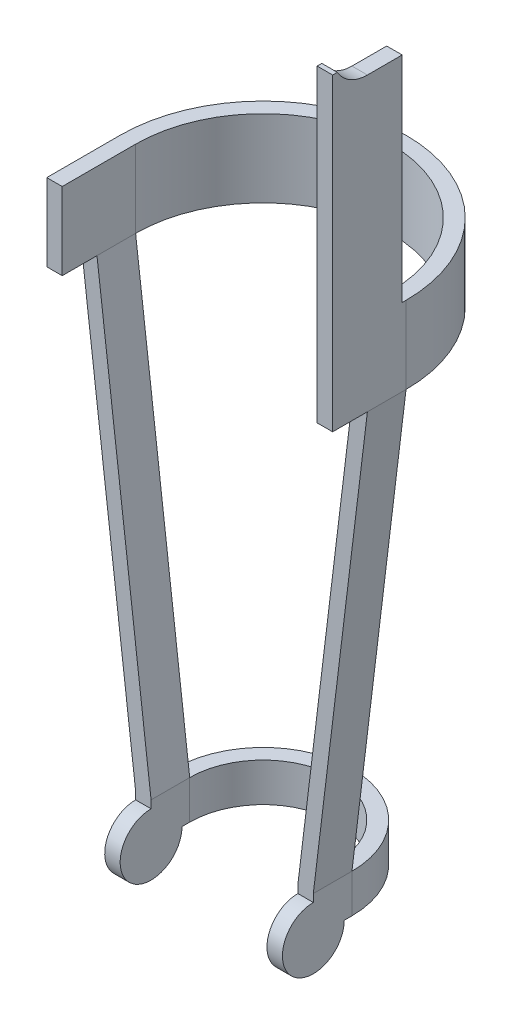
ISO-10303-21;
HEADER;
FILE_DESCRIPTION(('STEP AP214'),'2;1');
FILE_NAME('part.step','',(''),(''),'','','');
FILE_SCHEMA(('AUTOMOTIVE_DESIGN { 1 0 10303 214 1 1 1 1 }'));
ENDSEC;
DATA;
#1=APPLICATION_CONTEXT('core data for automotive mechanical design processes');
#2=APPLICATION_PROTOCOL_DEFINITION('international standard','automotive_design',2000,#1);
#3=PRODUCT_CONTEXT('',#1,'mechanical');
#4=PRODUCT('Part','Part','',(#3));
#5=PRODUCT_RELATED_PRODUCT_CATEGORY('part','',(#4));
#6=PRODUCT_DEFINITION_FORMATION('','',#4);
#7=PRODUCT_DEFINITION_CONTEXT('part definition',#1,'design');
#8=PRODUCT_DEFINITION('design','',#6,#7);
#9=PRODUCT_DEFINITION_SHAPE('','',#8);
#10=(LENGTH_UNIT() NAMED_UNIT(*) SI_UNIT(.MILLI.,.METRE.));
#11=(NAMED_UNIT(*) PLANE_ANGLE_UNIT() SI_UNIT($,.RADIAN.));
#12=(NAMED_UNIT(*) SI_UNIT($,.STERADIAN.) SOLID_ANGLE_UNIT());
#13=UNCERTAINTY_MEASURE_WITH_UNIT(LENGTH_MEASURE(1.E-05),#10,'distance_accuracy_value','');
#14=(GEOMETRIC_REPRESENTATION_CONTEXT(3) GLOBAL_UNCERTAINTY_ASSIGNED_CONTEXT((#13)) GLOBAL_UNIT_ASSIGNED_CONTEXT((#10,
#11,#12)) REPRESENTATION_CONTEXT('',''));
#15=CARTESIAN_POINT('',(0.,0.,0.));
#16=DIRECTION('',(0.,0.,1.));
#17=DIRECTION('',(1.,0.,0.));
#18=AXIS2_PLACEMENT_3D('',#15,#16,#17);
#19=CARTESIAN_POINT('',(46.,20.,20.));
#20=DIRECTION('',(0.,0.,-1.));
#21=DIRECTION('',(-1.,0.,0.));
#22=AXIS2_PLACEMENT_3D('',#19,#20,#21);
#23=PLANE('',#22);
#24=DIRECTION('',(1.,0.,0.));
#25=VECTOR('',#24,1.);
#26=CARTESIAN_POINT('',(46.,250.,20.));
#27=LINE('',#26,#25);
#28=CARTESIAN_POINT('',(66.,250.,20.));
#29=VERTEX_POINT('',#28);
#30=CARTESIAN_POINT('',(74.,250.,20.));
#31=VERTEX_POINT('',#30);
#32=EDGE_CURVE('E255',#29,#31,#27,.T.);
#33=ORIENTED_EDGE('',*,*,#32,.F.);
#34=DIRECTION('',(0.120846923167835,0.992671154592933,0.));
#35=VECTOR('',#34,1.);
#36=CARTESIAN_POINT('',(38.,20.,20.));
#37=LINE('',#36,#35);
#38=CARTESIAN_POINT('',(38.,20.,20.));
#39=VERTEX_POINT('',#38);
#40=EDGE_CURVE('E412',#39,#29,#37,.T.);
#41=ORIENTED_EDGE('',*,*,#40,.F.);
#42=DIRECTION('',(0.,-1.,0.));
#43=VECTOR('',#42,1.);
#44=CARTESIAN_POINT('',(38.,20.,20.));
#45=LINE('',#44,#43);
#46=CARTESIAN_POINT('',(38.,16.,20.));
#47=VERTEX_POINT('',#46);
#48=EDGE_CURVE('E539',#39,#47,#45,.T.);
#49=ORIENTED_EDGE('',*,*,#48,.T.);
#50=DIRECTION('',(1.,0.,0.));
#51=VECTOR('',#50,1.);
#52=CARTESIAN_POINT('',(38.,16.,20.));
#53=LINE('',#52,#51);
#54=CARTESIAN_POINT('',(46.,16.,20.));
#55=VERTEX_POINT('',#54);
#56=EDGE_CURVE('E644',#47,#55,#53,.T.);
#57=ORIENTED_EDGE('',*,*,#56,.T.);
#58=DIRECTION('',(0.,-1.,0.));
#59=VECTOR('',#58,1.);
#60=CARTESIAN_POINT('',(46.,20.,20.));
#61=LINE('',#60,#59);
#62=CARTESIAN_POINT('',(46.,20.,20.));
#63=VERTEX_POINT('',#62);
#64=EDGE_CURVE('E535',#63,#55,#61,.T.);
#65=ORIENTED_EDGE('',*,*,#64,.F.);
#66=DIRECTION('',(0.120846923167835,0.992671154592933,0.));
#67=VECTOR('',#66,1.);
#68=CARTESIAN_POINT('',(46.,20.,20.));
#69=LINE('',#68,#67);
#70=EDGE_CURVE('E381',#63,#31,#69,.T.);
#71=ORIENTED_EDGE('',*,*,#70,.T.);
#72=EDGE_LOOP('',(#33,#41,#49,#57,#65,#71));
#73=FACE_BOUND('',#72,.T.);
#74=ADVANCED_FACE('F39',(#73),#23,.F.);
#75=CARTESIAN_POINT('',(-46.,20.,20.));
#76=DIRECTION('',(0.,0.,-1.));
#77=DIRECTION('',(-1.,0.,0.));
#78=AXIS2_PLACEMENT_3D('',#75,#76,#77);
#79=PLANE('',#78);
#80=DIRECTION('',(1.,0.,0.));
#81=VECTOR('',#80,1.);
#82=CARTESIAN_POINT('',(-46.,250.,20.));
#83=LINE('',#82,#81);
#84=CARTESIAN_POINT('',(-74.,250.,20.));
#85=VERTEX_POINT('',#84);
#86=CARTESIAN_POINT('',(-66.,250.,20.));
#87=VERTEX_POINT('',#86);
#88=EDGE_CURVE('E233',#85,#87,#83,.T.);
#89=ORIENTED_EDGE('',*,*,#88,.F.);
#90=DIRECTION('',(-0.120846923167835,0.992671154592933,0.));
#91=VECTOR('',#90,1.);
#92=CARTESIAN_POINT('',(-46.,20.,20.));
#93=LINE('',#92,#91);
#94=CARTESIAN_POINT('',(-46.,20.,20.));
#95=VERTEX_POINT('',#94);
#96=EDGE_CURVE('E216',#95,#85,#93,.T.);
#97=ORIENTED_EDGE('',*,*,#96,.F.);
#98=DIRECTION('',(0.,-1.,0.));
#99=VECTOR('',#98,1.);
#100=CARTESIAN_POINT('',(-46.,20.,20.));
#101=LINE('',#100,#99);
#102=CARTESIAN_POINT('',(-46.,16.,20.));
#103=VERTEX_POINT('',#102);
#104=EDGE_CURVE('E524',#95,#103,#101,.T.);
#105=ORIENTED_EDGE('',*,*,#104,.T.);
#106=DIRECTION('',(-1.,0.,0.));
#107=VECTOR('',#106,1.);
#108=CARTESIAN_POINT('',(-38.,16.,20.));
#109=LINE('',#108,#107);
#110=CARTESIAN_POINT('',(-38.,16.,20.));
#111=VERTEX_POINT('',#110);
#112=EDGE_CURVE('E504',#103,#111,#109,.F.);
#113=ORIENTED_EDGE('',*,*,#112,.T.);
#114=DIRECTION('',(0.,-1.,0.));
#115=VECTOR('',#114,1.);
#116=CARTESIAN_POINT('',(-38.,20.,20.));
#117=LINE('',#116,#115);
#118=CARTESIAN_POINT('',(-38.,20.,20.));
#119=VERTEX_POINT('',#118);
#120=EDGE_CURVE('E493',#119,#111,#117,.T.);
#121=ORIENTED_EDGE('',*,*,#120,.F.);
#122=DIRECTION('',(-0.120846923167835,0.992671154592933,0.));
#123=VECTOR('',#122,1.);
#124=CARTESIAN_POINT('',(-38.,20.,20.));
#125=LINE('',#124,#123);
#126=EDGE_CURVE('E420',#119,#87,#125,.T.);
#127=ORIENTED_EDGE('',*,*,#126,.T.);
#128=EDGE_LOOP('',(#89,#97,#105,#113,#121,#127));
#129=FACE_BOUND('',#128,.T.);
#130=ADVANCED_FACE('F647',(#129),#79,.F.);
#131=CARTESIAN_POINT('',(0.,20.,0.));
#132=DIRECTION('',(0.,-1.,0.));
#133=DIRECTION('',(0.,0.,-1.));
#134=AXIS2_PLACEMENT_3D('',#131,#132,#133);
#135=CYLINDRICAL_SURFACE('',#134,38.);
#136=CARTESIAN_POINT('',(0.,0.,0.));
#137=DIRECTION('',(0.,-1.,0.));
#138=DIRECTION('',(0.,0.,1.));
#139=AXIS2_PLACEMENT_3D('',#136,#137,#138);
#140=CIRCLE('',#139,38.);
#141=CARTESIAN_POINT('',(-38.,0.,0.));
#142=VERTEX_POINT('',#141);
#143=CARTESIAN_POINT('',(38.,0.,0.));
#144=VERTEX_POINT('',#143);
#145=EDGE_CURVE('E499',#142,#144,#140,.T.);
#146=ORIENTED_EDGE('',*,*,#145,.T.);
#147=DIRECTION('',(0.,-1.,0.));
#148=VECTOR('',#147,1.);
#149=CARTESIAN_POINT('',(38.,20.,0.));
#150=LINE('',#149,#148);
#151=CARTESIAN_POINT('',(38.,20.,0.));
#152=VERTEX_POINT('',#151);
#153=EDGE_CURVE('E543',#152,#144,#150,.T.);
#154=ORIENTED_EDGE('',*,*,#153,.F.);
#155=CARTESIAN_POINT('',(0.,20.,0.));
#156=DIRECTION('',(0.,-1.,0.));
#157=DIRECTION('',(0.,0.,1.));
#158=AXIS2_PLACEMENT_3D('',#155,#156,#157);
#159=CIRCLE('',#158,38.);
#160=CARTESIAN_POINT('',(-38.,20.,0.));
#161=VERTEX_POINT('',#160);
#162=EDGE_CURVE('E520',#161,#152,#159,.T.);
#163=ORIENTED_EDGE('',*,*,#162,.F.);
#164=DIRECTION('',(0.,-1.,0.));
#165=VECTOR('',#164,1.);
#166=CARTESIAN_POINT('',(-38.,20.,0.));
#167=LINE('',#166,#165);
#168=EDGE_CURVE('E488',#161,#142,#167,.T.);
#169=ORIENTED_EDGE('',*,*,#168,.T.);
#170=EDGE_LOOP('',(#146,#154,#163,#169));
#171=FACE_BOUND('',#170,.T.);
#172=ADVANCED_FACE('F41',(#171),#135,.F.);
#173=CARTESIAN_POINT('',(38.,20.,0.));
#174=DIRECTION('',(1.,0.,0.));
#175=DIRECTION('',(0.,0.,-1.));
#176=AXIS2_PLACEMENT_3D('',#173,#174,#175);
#177=PLANE('',#176);
#178=DIRECTION('',(0.,0.,1.));
#179=VECTOR('',#178,1.);
#180=CARTESIAN_POINT('',(38.,0.,0.));
#181=LINE('',#180,#179);
#182=CARTESIAN_POINT('',(38.,0.,4.));
#183=VERTEX_POINT('',#182);
#184=EDGE_CURVE('E503',#144,#183,#181,.T.);
#185=ORIENTED_EDGE('',*,*,#184,.T.);
#186=CARTESIAN_POINT('',(38.,0.,20.));
#187=DIRECTION('',(1.,0.,0.));
#188=DIRECTION('',(0.,0.,-1.));
#189=AXIS2_PLACEMENT_3D('',#186,#187,#188);
#190=CIRCLE('',#189,16.);
#191=EDGE_CURVE('E385',#47,#183,#190,.T.);
#192=ORIENTED_EDGE('',*,*,#191,.F.);
#193=ORIENTED_EDGE('',*,*,#48,.F.);
#194=DIRECTION('',(0.,0.,1.));
#195=VECTOR('',#194,1.);
#196=CARTESIAN_POINT('',(38.,20.,0.));
#197=LINE('',#196,#195);
#198=EDGE_CURVE('E572',#152,#39,#197,.T.);
#199=ORIENTED_EDGE('',*,*,#198,.F.);
#200=ORIENTED_EDGE('',*,*,#153,.T.);
#201=EDGE_LOOP('',(#185,#192,#193,#199,#200));
#202=FACE_BOUND('',#201,.T.);
#203=ADVANCED_FACE('F656',(#202),#177,.F.);
#204=CARTESIAN_POINT('',(46.,20.,0.));
#205=DIRECTION('',(-1.,0.,0.));
#206=DIRECTION('',(0.,0.,1.));
#207=AXIS2_PLACEMENT_3D('',#204,#205,#206);
#208=PLANE('',#207);
#209=ORIENTED_EDGE('',*,*,#64,.T.);
#210=CARTESIAN_POINT('',(46.,0.,20.));
#211=DIRECTION('',(1.,0.,0.));
#212=DIRECTION('',(0.,0.,-1.));
#213=AXIS2_PLACEMENT_3D('',#210,#211,#212);
#214=CIRCLE('',#213,16.);
#215=CARTESIAN_POINT('',(46.,0.,4.));
#216=VERTEX_POINT('',#215);
#217=EDGE_CURVE('E416',#55,#216,#214,.T.);
#218=ORIENTED_EDGE('',*,*,#217,.T.);
#219=DIRECTION('',(0.,0.,-1.));
#220=VECTOR('',#219,1.);
#221=CARTESIAN_POINT('',(46.,0.,0.));
#222=LINE('',#221,#220);
#223=CARTESIAN_POINT('',(46.,0.,0.));
#224=VERTEX_POINT('',#223);
#225=EDGE_CURVE('E508',#216,#224,#222,.T.);
#226=ORIENTED_EDGE('',*,*,#225,.T.);
#227=DIRECTION('',(0.,-1.,0.));
#228=VECTOR('',#227,1.);
#229=CARTESIAN_POINT('',(46.,20.,0.));
#230=LINE('',#229,#228);
#231=CARTESIAN_POINT('',(46.,20.,0.));
#232=VERTEX_POINT('',#231);
#233=EDGE_CURVE('E531',#232,#224,#230,.T.);
#234=ORIENTED_EDGE('',*,*,#233,.F.);
#235=DIRECTION('',(0.,0.,-1.));
#236=VECTOR('',#235,1.);
#237=CARTESIAN_POINT('',(46.,20.,0.));
#238=LINE('',#237,#236);
#239=EDGE_CURVE('E575',#63,#232,#238,.T.);
#240=ORIENTED_EDGE('',*,*,#239,.F.);
#241=EDGE_LOOP('',(#209,#218,#226,#234,#240));
#242=FACE_BOUND('',#241,.T.);
#243=ADVANCED_FACE('F635',(#242),#208,.F.);
#244=CARTESIAN_POINT('',(0.,20.,0.));
#245=DIRECTION('',(0.,-1.,0.));
#246=DIRECTION('',(0.,0.,-1.));
#247=AXIS2_PLACEMENT_3D('',#244,#245,#246);
#248=CYLINDRICAL_SURFACE('',#247,46.);
#249=CARTESIAN_POINT('',(0.,0.,0.));
#250=DIRECTION('',(0.,1.,0.));
#251=DIRECTION('',(0.,0.,1.));
#252=AXIS2_PLACEMENT_3D('',#249,#250,#251);
#253=CIRCLE('',#252,46.);
#254=CARTESIAN_POINT('',(-46.,0.,0.));
#255=VERTEX_POINT('',#254);
#256=EDGE_CURVE('E511',#224,#255,#253,.T.);
#257=ORIENTED_EDGE('',*,*,#256,.T.);
#258=DIRECTION('',(0.,-1.,0.));
#259=VECTOR('',#258,1.);
#260=CARTESIAN_POINT('',(-46.,20.,0.));
#261=LINE('',#260,#259);
#262=CARTESIAN_POINT('',(-46.,20.,0.));
#263=VERTEX_POINT('',#262);
#264=EDGE_CURVE('E527',#263,#255,#261,.T.);
#265=ORIENTED_EDGE('',*,*,#264,.F.);
#266=CARTESIAN_POINT('',(0.,20.,0.));
#267=DIRECTION('',(0.,1.,0.));
#268=DIRECTION('',(0.,0.,1.));
#269=AXIS2_PLACEMENT_3D('',#266,#267,#268);
#270=CIRCLE('',#269,46.);
#271=EDGE_CURVE('E495',#232,#263,#270,.T.);
#272=ORIENTED_EDGE('',*,*,#271,.F.);
#273=ORIENTED_EDGE('',*,*,#233,.T.);
#274=EDGE_LOOP('',(#257,#265,#272,#273));
#275=FACE_BOUND('',#274,.T.);
#276=ADVANCED_FACE('F591',(#275),#248,.T.);
#277=CARTESIAN_POINT('',(-46.,20.,0.));
#278=DIRECTION('',(1.,0.,0.));
#279=DIRECTION('',(0.,0.,-1.));
#280=AXIS2_PLACEMENT_3D('',#277,#278,#279);
#281=PLANE('',#280);
#282=DIRECTION('',(0.,0.,1.));
#283=VECTOR('',#282,1.);
#284=CARTESIAN_POINT('',(-46.,0.,0.));
#285=LINE('',#284,#283);
#286=CARTESIAN_POINT('',(-46.,0.,4.));
#287=VERTEX_POINT('',#286);
#288=EDGE_CURVE('E514',#255,#287,#285,.T.);
#289=ORIENTED_EDGE('',*,*,#288,.T.);
#290=CARTESIAN_POINT('',(-46.,0.,20.));
#291=DIRECTION('',(-1.,0.,0.));
#292=DIRECTION('',(0.,0.,1.));
#293=AXIS2_PLACEMENT_3D('',#290,#291,#292);
#294=CIRCLE('',#293,16.);
#295=EDGE_CURVE('E640',#287,#103,#294,.T.);
#296=ORIENTED_EDGE('',*,*,#295,.T.);
#297=ORIENTED_EDGE('',*,*,#104,.F.);
#298=DIRECTION('',(0.,0.,1.));
#299=VECTOR('',#298,1.);
#300=CARTESIAN_POINT('',(-46.,20.,0.));
#301=LINE('',#300,#299);
#302=EDGE_CURVE('E453',#263,#95,#301,.T.);
#303=ORIENTED_EDGE('',*,*,#302,.F.);
#304=ORIENTED_EDGE('',*,*,#264,.T.);
#305=EDGE_LOOP('',(#289,#296,#297,#303,#304));
#306=FACE_BOUND('',#305,.T.);
#307=ADVANCED_FACE('F595',(#306),#281,.F.);
#308=CARTESIAN_POINT('',(-38.,20.,0.));
#309=DIRECTION('',(-1.,0.,0.));
#310=DIRECTION('',(0.,0.,1.));
#311=AXIS2_PLACEMENT_3D('',#308,#309,#310);
#312=PLANE('',#311);
#313=ORIENTED_EDGE('',*,*,#120,.T.);
#314=CARTESIAN_POINT('',(-38.,0.,20.));
#315=DIRECTION('',(-1.,0.,0.));
#316=DIRECTION('',(0.,0.,1.));
#317=AXIS2_PLACEMENT_3D('',#314,#315,#316);
#318=CIRCLE('',#317,16.);
#319=CARTESIAN_POINT('',(-38.,0.,4.));
#320=VERTEX_POINT('',#319);
#321=EDGE_CURVE('E643',#320,#111,#318,.T.);
#322=ORIENTED_EDGE('',*,*,#321,.F.);
#323=DIRECTION('',(0.,0.,-1.));
#324=VECTOR('',#323,1.);
#325=CARTESIAN_POINT('',(-38.,0.,0.));
#326=LINE('',#325,#324);
#327=EDGE_CURVE('E518',#320,#142,#326,.T.);
#328=ORIENTED_EDGE('',*,*,#327,.T.);
#329=ORIENTED_EDGE('',*,*,#168,.F.);
#330=DIRECTION('',(0.,0.,-1.));
#331=VECTOR('',#330,1.);
#332=CARTESIAN_POINT('',(-38.,20.,0.));
#333=LINE('',#332,#331);
#334=EDGE_CURVE('E482',#119,#161,#333,.T.);
#335=ORIENTED_EDGE('',*,*,#334,.F.);
#336=EDGE_LOOP('',(#313,#322,#328,#329,#335));
#337=FACE_BOUND('',#336,.T.);
#338=ADVANCED_FACE('F650',(#337),#312,.F.);
#339=CARTESIAN_POINT('',(0.,20.,0.));
#340=DIRECTION('',(0.,1.,0.));
#341=DIRECTION('',(0.,0.,1.));
#342=AXIS2_PLACEMENT_3D('',#339,#340,#341);
#343=PLANE('',#342);
#344=DIRECTION('',(-1.,0.,0.));
#345=VECTOR('',#344,1.);
#346=CARTESIAN_POINT('',(-46.,20.,0.));
#347=LINE('',#346,#345);
#348=EDGE_CURVE('E238',#161,#263,#347,.T.);
#349=ORIENTED_EDGE('',*,*,#348,.F.);
#350=ORIENTED_EDGE('',*,*,#162,.T.);
#351=DIRECTION('',(-1.,0.,0.));
#352=VECTOR('',#351,1.);
#353=CARTESIAN_POINT('',(46.,20.,0.));
#354=LINE('',#353,#352);
#355=EDGE_CURVE('E377',#232,#152,#354,.T.);
#356=ORIENTED_EDGE('',*,*,#355,.F.);
#357=ORIENTED_EDGE('',*,*,#271,.T.);
#358=EDGE_LOOP('',(#349,#350,#356,#357));
#359=FACE_BOUND('',#358,.T.);
#360=ADVANCED_FACE('F588',(#359),#343,.T.);
#361=CARTESIAN_POINT('',(0.,0.,0.));
#362=DIRECTION('',(0.,1.,0.));
#363=DIRECTION('',(0.,0.,1.));
#364=AXIS2_PLACEMENT_3D('',#361,#362,#363);
#365=PLANE('',#364);
#366=ORIENTED_EDGE('',*,*,#225,.F.);
#367=DIRECTION('',(1.,0.,0.));
#368=VECTOR('',#367,1.);
#369=CARTESIAN_POINT('',(38.,0.,4.));
#370=LINE('',#369,#368);
#371=EDGE_CURVE('E48',#216,#183,#370,.F.);
#372=ORIENTED_EDGE('',*,*,#371,.T.);
#373=ORIENTED_EDGE('',*,*,#184,.F.);
#374=ORIENTED_EDGE('',*,*,#145,.F.);
#375=ORIENTED_EDGE('',*,*,#327,.F.);
#376=DIRECTION('',(-1.,0.,0.));
#377=VECTOR('',#376,1.);
#378=CARTESIAN_POINT('',(-38.,0.,4.));
#379=LINE('',#378,#377);
#380=EDGE_CURVE('E547',#320,#287,#379,.T.);
#381=ORIENTED_EDGE('',*,*,#380,.T.);
#382=ORIENTED_EDGE('',*,*,#288,.F.);
#383=ORIENTED_EDGE('',*,*,#256,.F.);
#384=EDGE_LOOP('',(#366,#372,#373,#374,#375,#381,#382,#383));
#385=FACE_BOUND('',#384,.T.);
#386=ADVANCED_FACE('F638',(#385),#365,.F.);
#387=CARTESIAN_POINT('',(-38.,0.,20.));
#388=DIRECTION('',(-1.,0.,0.));
#389=DIRECTION('',(0.,0.,1.));
#390=AXIS2_PLACEMENT_3D('',#387,#388,#389);
#391=CYLINDRICAL_SURFACE('',#390,16.);
#392=ORIENTED_EDGE('',*,*,#112,.F.);
#393=ORIENTED_EDGE('',*,*,#295,.F.);
#394=ORIENTED_EDGE('',*,*,#380,.F.);
#395=ORIENTED_EDGE('',*,*,#321,.T.);
#396=EDGE_LOOP('',(#392,#393,#394,#395));
#397=FACE_BOUND('',#396,.T.);
#398=ADVANCED_FACE('F667',(#397),#391,.T.);
#399=CARTESIAN_POINT('',(38.,0.,20.));
#400=DIRECTION('',(1.,0.,0.));
#401=DIRECTION('',(0.,0.,-1.));
#402=AXIS2_PLACEMENT_3D('',#399,#400,#401);
#403=CYLINDRICAL_SURFACE('',#402,16.);
#404=ORIENTED_EDGE('',*,*,#56,.F.);
#405=ORIENTED_EDGE('',*,*,#191,.T.);
#406=ORIENTED_EDGE('',*,*,#371,.F.);
#407=ORIENTED_EDGE('',*,*,#217,.F.);
#408=EDGE_LOOP('',(#404,#405,#406,#407));
#409=FACE_BOUND('',#408,.T.);
#410=ADVANCED_FACE('F665',(#409),#403,.T.);
#411=CARTESIAN_POINT('',(46.,20.,20.));
#412=DIRECTION('',(0.992671154592933,-0.120846923167835,0.));
#413=DIRECTION('',(0.120846923167835,0.992671154592933,0.));
#414=AXIS2_PLACEMENT_3D('',#411,#412,#413);
#415=PLANE('',#414);
#416=DIRECTION('',(0.120846923167835,0.992671154592933,0.));
#417=VECTOR('',#416,1.);
#418=CARTESIAN_POINT('',(46.,20.,0.));
#419=LINE('',#418,#417);
#420=CARTESIAN_POINT('',(74.,250.,0.));
#421=VERTEX_POINT('',#420);
#422=EDGE_CURVE('E394',#232,#421,#419,.T.);
#423=ORIENTED_EDGE('',*,*,#422,.T.);
#424=DIRECTION('',(0.,0.,-1.));
#425=VECTOR('',#424,1.);
#426=CARTESIAN_POINT('',(74.,250.,20.));
#427=LINE('',#426,#425);
#428=EDGE_CURVE('E397',#31,#421,#427,.T.);
#429=ORIENTED_EDGE('',*,*,#428,.F.);
#430=ORIENTED_EDGE('',*,*,#70,.F.);
#431=ORIENTED_EDGE('',*,*,#239,.T.);
#432=EDGE_LOOP('',(#423,#429,#430,#431));
#433=FACE_BOUND('',#432,.T.);
#434=ADVANCED_FACE('F632',(#433),#415,.T.);
#435=CARTESIAN_POINT('',(46.,20.,0.));
#436=DIRECTION('',(0.,0.,-1.));
#437=DIRECTION('',(-1.,0.,0.));
#438=AXIS2_PLACEMENT_3D('',#435,#436,#437);
#439=PLANE('',#438);
#440=DIRECTION('',(0.120846923167835,0.992671154592933,0.));
#441=VECTOR('',#440,1.);
#442=CARTESIAN_POINT('',(38.,20.,0.));
#443=LINE('',#442,#441);
#444=CARTESIAN_POINT('',(66.,250.,0.));
#445=VERTEX_POINT('',#444);
#446=EDGE_CURVE('E393',#152,#445,#443,.T.);
#447=ORIENTED_EDGE('',*,*,#446,.T.);
#448=DIRECTION('',(-1.,0.,0.));
#449=VECTOR('',#448,1.);
#450=CARTESIAN_POINT('',(74.,250.,0.));
#451=LINE('',#450,#449);
#452=EDGE_CURVE('E388',#421,#445,#451,.T.);
#453=ORIENTED_EDGE('',*,*,#452,.F.);
#454=ORIENTED_EDGE('',*,*,#422,.F.);
#455=ORIENTED_EDGE('',*,*,#355,.T.);
#456=EDGE_LOOP('',(#447,#453,#454,#455));
#457=FACE_BOUND('',#456,.T.);
#458=ADVANCED_FACE('F631',(#457),#439,.T.);
#459=CARTESIAN_POINT('',(38.,20.,20.));
#460=DIRECTION('',(-0.992671154592933,0.120846923167835,0.));
#461=DIRECTION('',(-0.120846923167835,-0.992671154592933,0.));
#462=AXIS2_PLACEMENT_3D('',#459,#460,#461);
#463=PLANE('',#462);
#464=ORIENTED_EDGE('',*,*,#40,.T.);
#465=DIRECTION('',(0.,0.,1.));
#466=VECTOR('',#465,1.);
#467=CARTESIAN_POINT('',(66.,250.,20.));
#468=LINE('',#467,#466);
#469=EDGE_CURVE('E417',#445,#29,#468,.T.);
#470=ORIENTED_EDGE('',*,*,#469,.F.);
#471=ORIENTED_EDGE('',*,*,#446,.F.);
#472=ORIENTED_EDGE('',*,*,#198,.T.);
#473=EDGE_LOOP('',(#464,#470,#471,#472));
#474=FACE_BOUND('',#473,.T.);
#475=ADVANCED_FACE('F570',(#474),#463,.T.);
#476=CARTESIAN_POINT('',(0.,290.,0.));
#477=DIRECTION('',(0.,1.,0.));
#478=DIRECTION('',(0.,0.,1.));
#479=AXIS2_PLACEMENT_3D('',#476,#477,#478);
#480=PLANE('',#479);
#481=DIRECTION('',(0.,0.,1.));
#482=VECTOR('',#481,1.);
#483=CARTESIAN_POINT('',(74.,290.,0.));
#484=LINE('',#483,#482);
#485=CARTESIAN_POINT('',(74.,290.,0.));
#486=VERTEX_POINT('',#485);
#487=CARTESIAN_POINT('',(74.,290.,2.));
#488=VERTEX_POINT('',#487);
#489=EDGE_CURVE('E334',#486,#488,#484,.T.);
#490=ORIENTED_EDGE('',*,*,#489,.F.);
#491=CARTESIAN_POINT('',(0.,290.,0.));
#492=DIRECTION('',(0.,-1.,0.));
#493=DIRECTION('',(0.,0.,-1.));
#494=AXIS2_PLACEMENT_3D('',#491,#492,#493);
#495=CIRCLE('',#494,74.);
#496=CARTESIAN_POINT('',(-74.,290.,0.));
#497=VERTEX_POINT('',#496);
#498=EDGE_CURVE('E209',#497,#486,#495,.T.);
#499=ORIENTED_EDGE('',*,*,#498,.F.);
#500=DIRECTION('',(0.,0.,-1.));
#501=VECTOR('',#500,1.);
#502=CARTESIAN_POINT('',(-74.,290.,0.));
#503=LINE('',#502,#501);
#504=CARTESIAN_POINT('',(-74.,290.,38.));
#505=VERTEX_POINT('',#504);
#506=EDGE_CURVE('E202',#505,#497,#503,.T.);
#507=ORIENTED_EDGE('',*,*,#506,.F.);
#508=DIRECTION('',(1.,0.,0.));
#509=VECTOR('',#508,1.);
#510=CARTESIAN_POINT('',(-74.,290.,38.));
#511=LINE('',#510,#509);
#512=CARTESIAN_POINT('',(-66.,290.,38.));
#513=VERTEX_POINT('',#512);
#514=EDGE_CURVE('E207',#505,#513,#511,.T.);
#515=ORIENTED_EDGE('',*,*,#514,.T.);
#516=DIRECTION('',(0.,0.,1.));
#517=VECTOR('',#516,1.);
#518=CARTESIAN_POINT('',(-66.,290.,0.));
#519=LINE('',#518,#517);
#520=CARTESIAN_POINT('',(-66.,290.,0.));
#521=VERTEX_POINT('',#520);
#522=EDGE_CURVE('E365',#521,#513,#519,.T.);
#523=ORIENTED_EDGE('',*,*,#522,.F.);
#524=CARTESIAN_POINT('',(0.,290.,0.));
#525=DIRECTION('',(0.,1.,0.));
#526=DIRECTION('',(0.,0.,-1.));
#527=AXIS2_PLACEMENT_3D('',#524,#525,#526);
#528=CIRCLE('',#527,66.);
#529=CARTESIAN_POINT('',(66.,290.,0.));
#530=VERTEX_POINT('',#529);
#531=EDGE_CURVE('E330',#530,#521,#528,.T.);
#532=ORIENTED_EDGE('',*,*,#531,.F.);
#533=DIRECTION('',(0.,0.,-1.));
#534=VECTOR('',#533,1.);
#535=CARTESIAN_POINT('',(66.,290.,0.));
#536=LINE('',#535,#534);
#537=CARTESIAN_POINT('',(66.,290.,2.));
#538=VERTEX_POINT('',#537);
#539=EDGE_CURVE('E329',#538,#530,#536,.T.);
#540=ORIENTED_EDGE('',*,*,#539,.F.);
#541=DIRECTION('',(-1.,0.,0.));
#542=VECTOR('',#541,1.);
#543=CARTESIAN_POINT('',(0.,290.,2.));
#544=LINE('',#543,#542);
#545=EDGE_CURVE('E249',#488,#538,#544,.T.);
#546=ORIENTED_EDGE('',*,*,#545,.F.);
#547=EDGE_LOOP('',(#490,#499,#507,#515,#523,#532,#540,#546));
#548=FACE_BOUND('',#547,.T.);
#549=ADVANCED_FACE('F205',(#548),#480,.T.);
#550=CARTESIAN_POINT('',(0.,250.,0.));
#551=DIRECTION('',(0.,1.,0.));
#552=DIRECTION('',(0.,0.,1.));
#553=AXIS2_PLACEMENT_3D('',#550,#551,#552);
#554=PLANE('',#553);
#555=CARTESIAN_POINT('',(0.,250.,0.));
#556=DIRECTION('',(0.,1.,0.));
#557=DIRECTION('',(0.,0.,-1.));
#558=AXIS2_PLACEMENT_3D('',#555,#556,#557);
#559=CIRCLE('',#558,66.);
#560=CARTESIAN_POINT('',(-66.,250.,0.));
#561=VERTEX_POINT('',#560);
#562=EDGE_CURVE('E335',#445,#561,#559,.T.);
#563=ORIENTED_EDGE('',*,*,#562,.T.);
#564=DIRECTION('',(-1.,0.,0.));
#565=VECTOR('',#564,1.);
#566=CARTESIAN_POINT('',(-74.,250.,0.));
#567=LINE('',#566,#565);
#568=CARTESIAN_POINT('',(-74.,250.,0.));
#569=VERTEX_POINT('',#568);
#570=EDGE_CURVE('E427',#561,#569,#567,.T.);
#571=ORIENTED_EDGE('',*,*,#570,.T.);
#572=CARTESIAN_POINT('',(0.,250.,0.));
#573=DIRECTION('',(0.,-1.,0.));
#574=DIRECTION('',(0.,0.,-1.));
#575=AXIS2_PLACEMENT_3D('',#572,#573,#574);
#576=CIRCLE('',#575,74.);
#577=EDGE_CURVE('E382',#569,#421,#576,.T.);
#578=ORIENTED_EDGE('',*,*,#577,.T.);
#579=ORIENTED_EDGE('',*,*,#452,.T.);
#580=EDGE_LOOP('',(#563,#571,#578,#579));
#581=FACE_BOUND('',#580,.T.);
#582=ADVANCED_FACE('F470',(#581),#554,.F.);
#583=CARTESIAN_POINT('',(-74.,250.,0.));
#584=DIRECTION('',(1.,0.,0.));
#585=DIRECTION('',(0.,0.,-1.));
#586=AXIS2_PLACEMENT_3D('',#583,#584,#585);
#587=PLANE('',#586);
#588=DIRECTION('',(0.,-1.,0.));
#589=VECTOR('',#588,1.);
#590=CARTESIAN_POINT('',(-74.,410.,38.));
#591=LINE('',#590,#589);
#592=CARTESIAN_POINT('',(-74.,250.,38.));
#593=VERTEX_POINT('',#592);
#594=EDGE_CURVE('E221',#505,#593,#591,.T.);
#595=ORIENTED_EDGE('',*,*,#594,.F.);
#596=ORIENTED_EDGE('',*,*,#506,.T.);
#597=DIRECTION('',(0.,1.,0.));
#598=VECTOR('',#597,1.);
#599=CARTESIAN_POINT('',(-74.,250.,0.));
#600=LINE('',#599,#598);
#601=EDGE_CURVE('E374',#569,#497,#600,.T.);
#602=ORIENTED_EDGE('',*,*,#601,.F.);
#603=DIRECTION('',(0.,0.,-1.));
#604=VECTOR('',#603,1.);
#605=CARTESIAN_POINT('',(-74.,250.,0.));
#606=LINE('',#605,#604);
#607=EDGE_CURVE('E215',#85,#569,#606,.T.);
#608=ORIENTED_EDGE('',*,*,#607,.F.);
#609=DIRECTION('',(0.,0.,-1.));
#610=VECTOR('',#609,1.);
#611=CARTESIAN_POINT('',(-74.,250.,2.));
#612=LINE('',#611,#610);
#613=EDGE_CURVE('E230',#593,#85,#612,.T.);
#614=ORIENTED_EDGE('',*,*,#613,.F.);
#615=EDGE_LOOP('',(#595,#596,#602,#608,#614));
#616=FACE_BOUND('',#615,.T.);
#617=ADVANCED_FACE('F227',(#616),#587,.F.);
#618=CARTESIAN_POINT('',(-66.,250.,0.));
#619=DIRECTION('',(-1.,0.,0.));
#620=DIRECTION('',(0.,0.,1.));
#621=AXIS2_PLACEMENT_3D('',#618,#619,#620);
#622=PLANE('',#621);
#623=ORIENTED_EDGE('',*,*,#522,.T.);
#624=DIRECTION('',(0.,-1.,0.));
#625=VECTOR('',#624,1.);
#626=CARTESIAN_POINT('',(-66.,410.,38.));
#627=LINE('',#626,#625);
#628=CARTESIAN_POINT('',(-66.,250.,38.));
#629=VERTEX_POINT('',#628);
#630=EDGE_CURVE('E223',#513,#629,#627,.T.);
#631=ORIENTED_EDGE('',*,*,#630,.T.);
#632=DIRECTION('',(0.,0.,1.));
#633=VECTOR('',#632,1.);
#634=CARTESIAN_POINT('',(-66.,250.,2.));
#635=LINE('',#634,#633);
#636=EDGE_CURVE('E248',#87,#629,#635,.T.);
#637=ORIENTED_EDGE('',*,*,#636,.F.);
#638=DIRECTION('',(0.,0.,1.));
#639=VECTOR('',#638,1.);
#640=CARTESIAN_POINT('',(-66.,250.,0.));
#641=LINE('',#640,#639);
#642=EDGE_CURVE('E358',#561,#87,#641,.T.);
#643=ORIENTED_EDGE('',*,*,#642,.F.);
#644=DIRECTION('',(0.,1.,0.));
#645=VECTOR('',#644,1.);
#646=CARTESIAN_POINT('',(-66.,250.,0.));
#647=LINE('',#646,#645);
#648=EDGE_CURVE('E361',#561,#521,#647,.T.);
#649=ORIENTED_EDGE('',*,*,#648,.T.);
#650=EDGE_LOOP('',(#623,#631,#637,#643,#649));
#651=FACE_BOUND('',#650,.T.);
#652=ADVANCED_FACE('F463',(#651),#622,.F.);
#653=CARTESIAN_POINT('',(0.,250.,0.));
#654=DIRECTION('',(0.,1.,0.));
#655=DIRECTION('',(0.,0.,1.));
#656=AXIS2_PLACEMENT_3D('',#653,#654,#655);
#657=CYLINDRICAL_SURFACE('',#656,66.);
#658=ORIENTED_EDGE('',*,*,#531,.T.);
#659=ORIENTED_EDGE('',*,*,#648,.F.);
#660=ORIENTED_EDGE('',*,*,#562,.F.);
#661=DIRECTION('',(0.,1.,0.));
#662=VECTOR('',#661,1.);
#663=CARTESIAN_POINT('',(66.,250.,0.));
#664=LINE('',#663,#662);
#665=EDGE_CURVE('E341',#445,#530,#664,.T.);
#666=ORIENTED_EDGE('',*,*,#665,.T.);
#667=EDGE_LOOP('',(#658,#659,#660,#666));
#668=FACE_BOUND('',#667,.T.);
#669=ADVANCED_FACE('F467',(#668),#657,.F.);
#670=CARTESIAN_POINT('',(66.,250.,0.));
#671=DIRECTION('',(1.,0.,0.));
#672=DIRECTION('',(0.,0.,-1.));
#673=AXIS2_PLACEMENT_3D('',#670,#671,#672);
#674=PLANE('',#673);
#675=DIRECTION('',(0.,0.,-1.));
#676=VECTOR('',#675,1.);
#677=CARTESIAN_POINT('',(66.,410.,38.));
#678=LINE('',#677,#676);
#679=CARTESIAN_POINT('',(66.,410.,38.));
#680=VERTEX_POINT('',#679);
#681=CARTESIAN_POINT('',(66.,410.,35.5884572681199));
#682=VERTEX_POINT('',#681);
#683=EDGE_CURVE('E283',#680,#682,#678,.T.);
#684=ORIENTED_EDGE('',*,*,#683,.T.);
#685=CARTESIAN_POINT('',(66.,419.,20.));
#686=DIRECTION('',(1.,0.,0.));
#687=DIRECTION('',(0.,0.,-1.));
#688=AXIS2_PLACEMENT_3D('',#685,#686,#687);
#689=CIRCLE('',#688,18.);
#690=CARTESIAN_POINT('',(66.,401.,20.));
#691=VERTEX_POINT('',#690);
#692=EDGE_CURVE('E54',#682,#691,#689,.T.);
#693=ORIENTED_EDGE('',*,*,#692,.T.);
#694=DIRECTION('',(0.,0.,-1.));
#695=VECTOR('',#694,1.);
#696=CARTESIAN_POINT('',(66.,401.,0.));
#697=LINE('',#696,#695);
#698=CARTESIAN_POINT('',(66.,401.,2.));
#699=VERTEX_POINT('',#698);
#700=EDGE_CURVE('E300',#691,#699,#697,.T.);
#701=ORIENTED_EDGE('',*,*,#700,.T.);
#702=DIRECTION('',(0.,-1.,0.));
#703=VECTOR('',#702,1.);
#704=CARTESIAN_POINT('',(66.,410.,2.));
#705=LINE('',#704,#703);
#706=EDGE_CURVE('E62',#699,#538,#705,.T.);
#707=ORIENTED_EDGE('',*,*,#706,.T.);
#708=ORIENTED_EDGE('',*,*,#539,.T.);
#709=ORIENTED_EDGE('',*,*,#665,.F.);
#710=ORIENTED_EDGE('',*,*,#469,.T.);
#711=DIRECTION('',(0.,0.,-1.));
#712=VECTOR('',#711,1.);
#713=CARTESIAN_POINT('',(66.,250.,38.));
#714=LINE('',#713,#712);
#715=CARTESIAN_POINT('',(66.,250.,38.));
#716=VERTEX_POINT('',#715);
#717=EDGE_CURVE('E261',#716,#29,#714,.T.);
#718=ORIENTED_EDGE('',*,*,#717,.F.);
#719=DIRECTION('',(0.,-1.,0.));
#720=VECTOR('',#719,1.);
#721=CARTESIAN_POINT('',(66.,410.,38.));
#722=LINE('',#721,#720);
#723=EDGE_CURVE('E278',#680,#716,#722,.T.);
#724=ORIENTED_EDGE('',*,*,#723,.F.);
#725=EDGE_LOOP('',(#684,#693,#701,#707,#708,#709,#710,#718,#724));
#726=FACE_BOUND('',#725,.T.);
#727=ADVANCED_FACE('F320',(#726),#674,.F.);
#728=CARTESIAN_POINT('',(74.,250.,0.));
#729=DIRECTION('',(-1.,0.,0.));
#730=DIRECTION('',(0.,0.,1.));
#731=AXIS2_PLACEMENT_3D('',#728,#729,#730);
#732=PLANE('',#731);
#733=DIRECTION('',(0.,0.,1.));
#734=VECTOR('',#733,1.);
#735=CARTESIAN_POINT('',(74.,401.,0.));
#736=LINE('',#735,#734);
#737=CARTESIAN_POINT('',(74.,401.,2.));
#738=VERTEX_POINT('',#737);
#739=CARTESIAN_POINT('',(74.,401.,20.));
#740=VERTEX_POINT('',#739);
#741=EDGE_CURVE('E303',#738,#740,#736,.T.);
#742=ORIENTED_EDGE('',*,*,#741,.T.);
#743=CARTESIAN_POINT('',(74.,419.,20.));
#744=DIRECTION('',(-1.,0.,0.));
#745=DIRECTION('',(0.,0.,1.));
#746=AXIS2_PLACEMENT_3D('',#743,#744,#745);
#747=CIRCLE('',#746,18.);
#748=CARTESIAN_POINT('',(74.,410.,35.5884572681199));
#749=VERTEX_POINT('',#748);
#750=EDGE_CURVE('E309',#740,#749,#747,.T.);
#751=ORIENTED_EDGE('',*,*,#750,.T.);
#752=DIRECTION('',(0.,0.,1.));
#753=VECTOR('',#752,1.);
#754=CARTESIAN_POINT('',(74.,410.,38.));
#755=LINE('',#754,#753);
#756=CARTESIAN_POINT('',(74.,410.,38.));
#757=VERTEX_POINT('',#756);
#758=EDGE_CURVE('E266',#749,#757,#755,.T.);
#759=ORIENTED_EDGE('',*,*,#758,.T.);
#760=DIRECTION('',(0.,-1.,0.));
#761=VECTOR('',#760,1.);
#762=CARTESIAN_POINT('',(74.,410.,38.));
#763=LINE('',#762,#761);
#764=CARTESIAN_POINT('',(74.,250.,38.));
#765=VERTEX_POINT('',#764);
#766=EDGE_CURVE('E280',#757,#765,#763,.T.);
#767=ORIENTED_EDGE('',*,*,#766,.T.);
#768=DIRECTION('',(0.,0.,1.));
#769=VECTOR('',#768,1.);
#770=CARTESIAN_POINT('',(74.,250.,38.));
#771=LINE('',#770,#769);
#772=EDGE_CURVE('E268',#31,#765,#771,.T.);
#773=ORIENTED_EDGE('',*,*,#772,.F.);
#774=ORIENTED_EDGE('',*,*,#428,.T.);
#775=DIRECTION('',(0.,1.,0.));
#776=VECTOR('',#775,1.);
#777=CARTESIAN_POINT('',(74.,250.,0.));
#778=LINE('',#777,#776);
#779=EDGE_CURVE('E338',#421,#486,#778,.T.);
#780=ORIENTED_EDGE('',*,*,#779,.T.);
#781=ORIENTED_EDGE('',*,*,#489,.T.);
#782=DIRECTION('',(0.,-1.,0.));
#783=VECTOR('',#782,1.);
#784=CARTESIAN_POINT('',(74.,410.,2.));
#785=LINE('',#784,#783);
#786=EDGE_CURVE('E260',#738,#488,#785,.T.);
#787=ORIENTED_EDGE('',*,*,#786,.F.);
#788=EDGE_LOOP('',(#742,#751,#759,#767,#773,#774,#780,#781,#787));
#789=FACE_BOUND('',#788,.T.);
#790=ADVANCED_FACE('F626',(#789),#732,.F.);
#791=CARTESIAN_POINT('',(0.,250.,0.));
#792=DIRECTION('',(0.,1.,0.));
#793=DIRECTION('',(0.,0.,1.));
#794=AXIS2_PLACEMENT_3D('',#791,#792,#793);
#795=CYLINDRICAL_SURFACE('',#794,74.);
#796=ORIENTED_EDGE('',*,*,#498,.T.);
#797=ORIENTED_EDGE('',*,*,#779,.F.);
#798=ORIENTED_EDGE('',*,*,#577,.F.);
#799=ORIENTED_EDGE('',*,*,#601,.T.);
#800=EDGE_LOOP('',(#796,#797,#798,#799));
#801=FACE_BOUND('',#800,.T.);
#802=ADVANCED_FACE('F625',(#801),#795,.T.);
#803=CARTESIAN_POINT('',(-38.,20.,20.));
#804=DIRECTION('',(0.992671154592933,0.120846923167835,0.));
#805=DIRECTION('',(-0.120846923167835,0.992671154592933,0.));
#806=AXIS2_PLACEMENT_3D('',#803,#804,#805);
#807=PLANE('',#806);
#808=DIRECTION('',(-0.120846923167835,0.992671154592933,0.));
#809=VECTOR('',#808,1.);
#810=CARTESIAN_POINT('',(-38.,20.,0.));
#811=LINE('',#810,#809);
#812=EDGE_CURVE('E424',#161,#561,#811,.T.);
#813=ORIENTED_EDGE('',*,*,#812,.T.);
#814=ORIENTED_EDGE('',*,*,#642,.T.);
#815=ORIENTED_EDGE('',*,*,#126,.F.);
#816=ORIENTED_EDGE('',*,*,#334,.T.);
#817=EDGE_LOOP('',(#813,#814,#815,#816));
#818=FACE_BOUND('',#817,.T.);
#819=ADVANCED_FACE('F480',(#818),#807,.T.);
#820=CARTESIAN_POINT('',(-46.,20.,0.));
#821=DIRECTION('',(0.,0.,-1.));
#822=DIRECTION('',(-1.,0.,0.));
#823=AXIS2_PLACEMENT_3D('',#820,#821,#822);
#824=PLANE('',#823);
#825=DIRECTION('',(-0.120846923167835,0.992671154592933,0.));
#826=VECTOR('',#825,1.);
#827=CARTESIAN_POINT('',(-46.,20.,0.));
#828=LINE('',#827,#826);
#829=EDGE_CURVE('E431',#263,#569,#828,.T.);
#830=ORIENTED_EDGE('',*,*,#829,.T.);
#831=ORIENTED_EDGE('',*,*,#570,.F.);
#832=ORIENTED_EDGE('',*,*,#812,.F.);
#833=ORIENTED_EDGE('',*,*,#348,.T.);
#834=EDGE_LOOP('',(#830,#831,#832,#833));
#835=FACE_BOUND('',#834,.T.);
#836=ADVANCED_FACE('F476',(#835),#824,.T.);
#837=CARTESIAN_POINT('',(-46.,20.,20.));
#838=DIRECTION('',(-0.992671154592933,-0.120846923167835,0.));
#839=DIRECTION('',(0.120846923167835,-0.992671154592933,0.));
#840=AXIS2_PLACEMENT_3D('',#837,#838,#839);
#841=PLANE('',#840);
#842=ORIENTED_EDGE('',*,*,#96,.T.);
#843=ORIENTED_EDGE('',*,*,#607,.T.);
#844=ORIENTED_EDGE('',*,*,#829,.F.);
#845=ORIENTED_EDGE('',*,*,#302,.T.);
#846=EDGE_LOOP('',(#842,#843,#844,#845));
#847=FACE_BOUND('',#846,.T.);
#848=ADVANCED_FACE('F450',(#847),#841,.T.);
#849=CARTESIAN_POINT('',(0.,250.,0.));
#850=DIRECTION('',(0.,1.,0.));
#851=DIRECTION('',(0.,0.,1.));
#852=AXIS2_PLACEMENT_3D('',#849,#850,#851);
#853=PLANE('',#852);
#854=ORIENTED_EDGE('',*,*,#613,.T.);
#855=ORIENTED_EDGE('',*,*,#88,.T.);
#856=ORIENTED_EDGE('',*,*,#636,.T.);
#857=DIRECTION('',(-1.,0.,0.));
#858=VECTOR('',#857,1.);
#859=CARTESIAN_POINT('',(-74.,250.,38.));
#860=LINE('',#859,#858);
#861=EDGE_CURVE('E240',#629,#593,#860,.T.);
#862=ORIENTED_EDGE('',*,*,#861,.T.);
#863=EDGE_LOOP('',(#854,#855,#856,#862));
#864=FACE_BOUND('',#863,.T.);
#865=ADVANCED_FACE('F457',(#864),#853,.F.);
#866=CARTESIAN_POINT('',(-74.,410.,38.));
#867=DIRECTION('',(0.,0.,1.));
#868=DIRECTION('',(1.,0.,0.));
#869=AXIS2_PLACEMENT_3D('',#866,#867,#868);
#870=PLANE('',#869);
#871=ORIENTED_EDGE('',*,*,#514,.F.);
#872=ORIENTED_EDGE('',*,*,#594,.T.);
#873=ORIENTED_EDGE('',*,*,#861,.F.);
#874=ORIENTED_EDGE('',*,*,#630,.F.);
#875=EDGE_LOOP('',(#871,#872,#873,#874));
#876=FACE_BOUND('',#875,.T.);
#877=ADVANCED_FACE('F219',(#876),#870,.T.);
#878=CARTESIAN_POINT('',(0.,250.,0.));
#879=DIRECTION('',(0.,1.,0.));
#880=DIRECTION('',(0.,0.,1.));
#881=AXIS2_PLACEMENT_3D('',#878,#879,#880);
#882=PLANE('',#881);
#883=ORIENTED_EDGE('',*,*,#717,.T.);
#884=ORIENTED_EDGE('',*,*,#32,.T.);
#885=ORIENTED_EDGE('',*,*,#772,.T.);
#886=DIRECTION('',(-1.,0.,0.));
#887=VECTOR('',#886,1.);
#888=CARTESIAN_POINT('',(74.,250.,38.));
#889=LINE('',#888,#887);
#890=EDGE_CURVE('E267',#765,#716,#889,.T.);
#891=ORIENTED_EDGE('',*,*,#890,.T.);
#892=EDGE_LOOP('',(#883,#884,#885,#891));
#893=FACE_BOUND('',#892,.T.);
#894=ADVANCED_FACE('F565',(#893),#882,.F.);
#895=CARTESIAN_POINT('',(74.,410.,2.));
#896=DIRECTION('',(0.,0.,-1.));
#897=DIRECTION('',(-1.,0.,0.));
#898=AXIS2_PLACEMENT_3D('',#895,#896,#897);
#899=PLANE('',#898);
#900=DIRECTION('',(-1.,0.,0.));
#901=VECTOR('',#900,1.);
#902=CARTESIAN_POINT('',(86.,401.,2.));
#903=LINE('',#902,#901);
#904=EDGE_CURVE('E225',#738,#699,#903,.T.);
#905=ORIENTED_EDGE('',*,*,#904,.F.);
#906=ORIENTED_EDGE('',*,*,#786,.T.);
#907=ORIENTED_EDGE('',*,*,#545,.T.);
#908=ORIENTED_EDGE('',*,*,#706,.F.);
#909=EDGE_LOOP('',(#905,#906,#907,#908));
#910=FACE_BOUND('',#909,.T.);
#911=ADVANCED_FACE('F323',(#910),#899,.T.);
#912=CARTESIAN_POINT('',(74.,410.,38.));
#913=DIRECTION('',(0.,0.,1.));
#914=DIRECTION('',(1.,0.,0.));
#915=AXIS2_PLACEMENT_3D('',#912,#913,#914);
#916=PLANE('',#915);
#917=ORIENTED_EDGE('',*,*,#890,.F.);
#918=ORIENTED_EDGE('',*,*,#766,.F.);
#919=DIRECTION('',(-1.,0.,0.));
#920=VECTOR('',#919,1.);
#921=CARTESIAN_POINT('',(74.,410.,38.));
#922=LINE('',#921,#920);
#923=EDGE_CURVE('E290',#757,#680,#922,.T.);
#924=ORIENTED_EDGE('',*,*,#923,.T.);
#925=ORIENTED_EDGE('',*,*,#723,.T.);
#926=EDGE_LOOP('',(#917,#918,#924,#925));
#927=FACE_BOUND('',#926,.T.);
#928=ADVANCED_FACE('F827',(#927),#916,.T.);
#929=CARTESIAN_POINT('',(0.,410.,0.));
#930=DIRECTION('',(0.,1.,0.));
#931=DIRECTION('',(0.,0.,1.));
#932=AXIS2_PLACEMENT_3D('',#929,#930,#931);
#933=PLANE('',#932);
#934=DIRECTION('',(-1.,0.,0.));
#935=VECTOR('',#934,1.);
#936=CARTESIAN_POINT('',(86.,410.,35.5884572681199));
#937=LINE('',#936,#935);
#938=EDGE_CURVE('E12',#682,#749,#937,.F.);
#939=ORIENTED_EDGE('',*,*,#938,.F.);
#940=ORIENTED_EDGE('',*,*,#683,.F.);
#941=ORIENTED_EDGE('',*,*,#923,.F.);
#942=ORIENTED_EDGE('',*,*,#758,.F.);
#943=EDGE_LOOP('',(#939,#940,#941,#942));
#944=FACE_BOUND('',#943,.T.);
#945=ADVANCED_FACE('F834',(#944),#933,.T.);
#946=CARTESIAN_POINT('',(86.,419.,20.));
#947=DIRECTION('',(-1.,0.,0.));
#948=DIRECTION('',(0.,0.,1.));
#949=AXIS2_PLACEMENT_3D('',#946,#947,#948);
#950=CYLINDRICAL_SURFACE('',#949,18.);
#951=ORIENTED_EDGE('',*,*,#938,.T.);
#952=ORIENTED_EDGE('',*,*,#750,.F.);
#953=DIRECTION('',(-1.,0.,0.));
#954=VECTOR('',#953,1.);
#955=CARTESIAN_POINT('',(86.,401.,20.));
#956=LINE('',#955,#954);
#957=EDGE_CURVE('E313',#740,#691,#956,.T.);
#958=ORIENTED_EDGE('',*,*,#957,.T.);
#959=ORIENTED_EDGE('',*,*,#692,.F.);
#960=EDGE_LOOP('',(#951,#952,#958,#959));
#961=FACE_BOUND('',#960,.T.);
#962=ADVANCED_FACE('F318',(#961),#950,.F.);
#963=CARTESIAN_POINT('',(86.,401.,20.));
#964=DIRECTION('',(0.,-1.,0.));
#965=DIRECTION('',(0.,0.,-1.));
#966=AXIS2_PLACEMENT_3D('',#963,#964,#965);
#967=PLANE('',#966);
#968=ORIENTED_EDGE('',*,*,#957,.F.);
#969=ORIENTED_EDGE('',*,*,#741,.F.);
#970=ORIENTED_EDGE('',*,*,#904,.T.);
#971=ORIENTED_EDGE('',*,*,#700,.F.);
#972=EDGE_LOOP('',(#968,#969,#970,#971));
#973=FACE_BOUND('',#972,.T.);
#974=ADVANCED_FACE('F848',(#973),#967,.F.);
#975=CLOSED_SHELL('',(#74,#130,#172,#203,#243,#276,#307,#338,#360,#386,#398,#410,#434,#458,#475,
#549,#582,#617,#652,#669,#727,#790,#802,#819,#836,#848,#865,#877,#894,#911,#928,#945,#962,#974));
#976=MANIFOLD_SOLID_BREP('B2',#975);
#977=ADVANCED_BREP_SHAPE_REPRESENTATION('',(#18,#976),#14);
#978=SHAPE_DEFINITION_REPRESENTATION(#9,#977);
ENDSEC;
END-ISO-10303-21;
